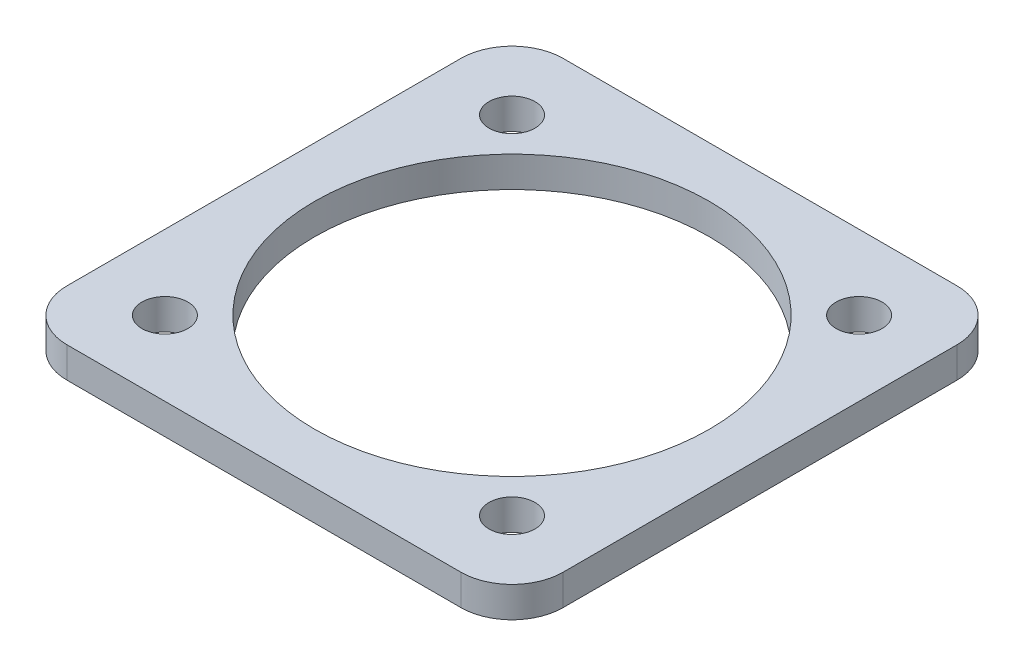
ISO-10303-21;
HEADER;
FILE_DESCRIPTION(('STEP AP214'),'2;1');
FILE_NAME('part.step','',(''),(''),'','','');
FILE_SCHEMA(('AUTOMOTIVE_DESIGN { 1 0 10303 214 1 1 1 1 }'));
ENDSEC;
DATA;
#1=APPLICATION_CONTEXT('core data for automotive mechanical design processes');
#2=APPLICATION_PROTOCOL_DEFINITION('international standard','automotive_design',2000,#1);
#3=PRODUCT_CONTEXT('',#1,'mechanical');
#4=PRODUCT('Part','Part','',(#3));
#5=PRODUCT_RELATED_PRODUCT_CATEGORY('part','',(#4));
#6=PRODUCT_DEFINITION_FORMATION('','',#4);
#7=PRODUCT_DEFINITION_CONTEXT('part definition',#1,'design');
#8=PRODUCT_DEFINITION('design','',#6,#7);
#9=PRODUCT_DEFINITION_SHAPE('','',#8);
#10=(LENGTH_UNIT() NAMED_UNIT(*) SI_UNIT(.MILLI.,.METRE.));
#11=(NAMED_UNIT(*) PLANE_ANGLE_UNIT() SI_UNIT($,.RADIAN.));
#12=(NAMED_UNIT(*) SI_UNIT($,.STERADIAN.) SOLID_ANGLE_UNIT());
#13=UNCERTAINTY_MEASURE_WITH_UNIT(LENGTH_MEASURE(1.E-05),#10,'distance_accuracy_value','');
#14=(GEOMETRIC_REPRESENTATION_CONTEXT(3) GLOBAL_UNCERTAINTY_ASSIGNED_CONTEXT((#13)) GLOBAL_UNIT_ASSIGNED_CONTEXT((#10,
#11,#12)) REPRESENTATION_CONTEXT('',''));
#15=CARTESIAN_POINT('',(0.,0.,0.));
#16=DIRECTION('',(0.,0.,1.));
#17=DIRECTION('',(1.,0.,0.));
#18=AXIS2_PLACEMENT_3D('',#15,#16,#17);
#19=CARTESIAN_POINT('',(-19.2537625946986,3.,19.2537625946986));
#20=DIRECTION('',(0.,-1.,0.));
#21=DIRECTION('',(0.,0.,-1.));
#22=AXIS2_PLACEMENT_3D('',#19,#20,#21);
#23=PLANE('',#22);
#24=CARTESIAN_POINT('',(-19.2537625946986,3.,19.2537625946986));
#25=DIRECTION('',(0.,1.,0.));
#26=DIRECTION('',(0.,0.,-1.));
#27=AXIS2_PLACEMENT_3D('',#24,#25,#26);
#28=CIRCLE('',#27,5.);
#29=CARTESIAN_POINT('',(-24.2537625946986,3.,19.2537625946986));
#30=VERTEX_POINT('',#29);
#31=CARTESIAN_POINT('',(-19.2537625946986,3.,24.2537625946986));
#32=VERTEX_POINT('',#31);
#33=EDGE_CURVE('E148',#30,#32,#28,.T.);
#34=ORIENTED_EDGE('',*,*,#33,.T.);
#35=DIRECTION('',(1.,0.,0.));
#36=VECTOR('',#35,1.);
#37=CARTESIAN_POINT('',(-19.2537625946986,3.,24.2537625946986));
#38=LINE('',#37,#36);
#39=CARTESIAN_POINT('',(19.2537625946986,3.,24.2537625946986));
#40=VERTEX_POINT('',#39);
#41=EDGE_CURVE('E96',#32,#40,#38,.T.);
#42=ORIENTED_EDGE('',*,*,#41,.T.);
#43=CARTESIAN_POINT('',(19.2537625946986,3.,19.2537625946986));
#44=DIRECTION('',(0.,1.,0.));
#45=DIRECTION('',(0.,0.,1.));
#46=AXIS2_PLACEMENT_3D('',#43,#44,#45);
#47=CIRCLE('',#46,5.);
#48=CARTESIAN_POINT('',(24.2537625946986,3.,19.2537625946986));
#49=VERTEX_POINT('',#48);
#50=EDGE_CURVE('E163',#40,#49,#47,.T.);
#51=ORIENTED_EDGE('',*,*,#50,.T.);
#52=DIRECTION('',(0.,0.,-1.));
#53=VECTOR('',#52,1.);
#54=CARTESIAN_POINT('',(24.2537625946986,3.,19.2537625946986));
#55=LINE('',#54,#53);
#56=CARTESIAN_POINT('',(24.2537625946986,3.,-19.2537625946986));
#57=VERTEX_POINT('',#56);
#58=EDGE_CURVE('E176',#49,#57,#55,.T.);
#59=ORIENTED_EDGE('',*,*,#58,.T.);
#60=CARTESIAN_POINT('',(19.2537625946986,3.,-19.2537625946986));
#61=DIRECTION('',(0.,1.,0.));
#62=DIRECTION('',(0.,0.,-1.));
#63=AXIS2_PLACEMENT_3D('',#60,#61,#62);
#64=CIRCLE('',#63,5.);
#65=CARTESIAN_POINT('',(19.2537625946986,3.,-24.2537625946986));
#66=VERTEX_POINT('',#65);
#67=EDGE_CURVE('E115',#57,#66,#64,.T.);
#68=ORIENTED_EDGE('',*,*,#67,.T.);
#69=DIRECTION('',(-1.,0.,0.));
#70=VECTOR('',#69,1.);
#71=CARTESIAN_POINT('',(-19.2537625946986,3.,-24.2537625946986));
#72=LINE('',#71,#70);
#73=CARTESIAN_POINT('',(-19.2537625946986,3.,-24.2537625946986));
#74=VERTEX_POINT('',#73);
#75=EDGE_CURVE('E109',#66,#74,#72,.T.);
#76=ORIENTED_EDGE('',*,*,#75,.T.);
#77=CARTESIAN_POINT('',(-19.2537625946986,3.,-19.2537625946986));
#78=DIRECTION('',(0.,1.,0.));
#79=DIRECTION('',(0.,0.,-1.));
#80=AXIS2_PLACEMENT_3D('',#77,#78,#79);
#81=CIRCLE('',#80,5.);
#82=CARTESIAN_POINT('',(-24.2537625946986,3.,-19.2537625946986));
#83=VERTEX_POINT('',#82);
#84=EDGE_CURVE('E113',#74,#83,#81,.T.);
#85=ORIENTED_EDGE('',*,*,#84,.T.);
#86=DIRECTION('',(0.,0.,1.));
#87=VECTOR('',#86,1.);
#88=CARTESIAN_POINT('',(-24.2537625946986,3.,19.2537625946986));
#89=LINE('',#88,#87);
#90=EDGE_CURVE('E53',#83,#30,#89,.T.);
#91=ORIENTED_EDGE('',*,*,#90,.T.);
#92=EDGE_LOOP('',(#34,#42,#51,#59,#68,#76,#85,#91));
#93=FACE_BOUND('',#92,.T.);
#94=CARTESIAN_POINT('',(0.,3.,0.));
#95=DIRECTION('',(0.,1.,0.));
#96=DIRECTION('',(0.,0.,1.));
#97=AXIS2_PLACEMENT_3D('',#94,#95,#96);
#98=CIRCLE('',#97,19.3);
#99=CARTESIAN_POINT('',(0.,3.,19.3));
#100=VERTEX_POINT('',#99);
#101=EDGE_CURVE('E137',#100,#100,#98,.T.);
#102=ORIENTED_EDGE('',*,*,#101,.F.);
#103=EDGE_LOOP('',(#102));
#104=FACE_BOUND('',#103,.T.);
#105=CARTESIAN_POINT('',(-16.9705627484771,3.,-16.9705627484771));
#106=DIRECTION('',(0.,1.,0.));
#107=DIRECTION('',(0.,0.,1.));
#108=AXIS2_PLACEMENT_3D('',#105,#106,#107);
#109=CIRCLE('',#108,2.25);
#110=CARTESIAN_POINT('',(-16.9705627484771,3.,-14.7205627484771));
#111=VERTEX_POINT('',#110);
#112=EDGE_CURVE('E185',#111,#111,#109,.T.);
#113=ORIENTED_EDGE('',*,*,#112,.F.);
#114=EDGE_LOOP('',(#113));
#115=FACE_BOUND('',#114,.T.);
#116=CARTESIAN_POINT('',(16.9705627484771,3.,-16.9705627484771));
#117=DIRECTION('',(0.,1.,0.));
#118=DIRECTION('',(0.,0.,1.));
#119=AXIS2_PLACEMENT_3D('',#116,#117,#118);
#120=CIRCLE('',#119,2.25);
#121=CARTESIAN_POINT('',(16.9705627484771,3.,-14.7205627484771));
#122=VERTEX_POINT('',#121);
#123=EDGE_CURVE('E191',#122,#122,#120,.T.);
#124=ORIENTED_EDGE('',*,*,#123,.F.);
#125=EDGE_LOOP('',(#124));
#126=FACE_BOUND('',#125,.T.);
#127=CARTESIAN_POINT('',(16.9705627484771,3.,16.9705627484771));
#128=DIRECTION('',(0.,1.,0.));
#129=DIRECTION('',(0.,0.,1.));
#130=AXIS2_PLACEMENT_3D('',#127,#128,#129);
#131=CIRCLE('',#130,2.25);
#132=CARTESIAN_POINT('',(16.9705627484771,3.,19.2205627484771));
#133=VERTEX_POINT('',#132);
#134=EDGE_CURVE('E197',#133,#133,#131,.T.);
#135=ORIENTED_EDGE('',*,*,#134,.F.);
#136=EDGE_LOOP('',(#135));
#137=FACE_BOUND('',#136,.T.);
#138=CARTESIAN_POINT('',(-16.9705627484771,3.,16.9705627484771));
#139=DIRECTION('',(0.,1.,0.));
#140=DIRECTION('',(0.,0.,1.));
#141=AXIS2_PLACEMENT_3D('',#138,#139,#140);
#142=CIRCLE('',#141,2.25);
#143=CARTESIAN_POINT('',(-16.9705627484771,3.,19.2205627484771));
#144=VERTEX_POINT('',#143);
#145=EDGE_CURVE('E203',#144,#144,#142,.T.);
#146=ORIENTED_EDGE('',*,*,#145,.F.);
#147=EDGE_LOOP('',(#146));
#148=FACE_BOUND('',#147,.T.);
#149=ADVANCED_FACE('F36',(#93,#104,#115,#126,#137,#148),#23,.F.);
#150=CARTESIAN_POINT('',(-19.2537625946986,0.,19.2537625946986));
#151=DIRECTION('',(0.,-1.,0.));
#152=DIRECTION('',(0.,0.,-1.));
#153=AXIS2_PLACEMENT_3D('',#150,#151,#152);
#154=PLANE('',#153);
#155=CARTESIAN_POINT('',(16.9705627484771,0.,16.9705627484771));
#156=DIRECTION('',(0.,1.,0.));
#157=DIRECTION('',(0.,0.,1.));
#158=AXIS2_PLACEMENT_3D('',#155,#156,#157);
#159=CIRCLE('',#158,2.25);
#160=CARTESIAN_POINT('',(16.9705627484771,0.,19.2205627484771));
#161=VERTEX_POINT('',#160);
#162=EDGE_CURVE('E200',#161,#161,#159,.T.);
#163=ORIENTED_EDGE('',*,*,#162,.T.);
#164=EDGE_LOOP('',(#163));
#165=FACE_BOUND('',#164,.T.);
#166=CARTESIAN_POINT('',(-16.9705627484771,0.,-16.9705627484771));
#167=DIRECTION('',(0.,1.,0.));
#168=DIRECTION('',(0.,0.,1.));
#169=AXIS2_PLACEMENT_3D('',#166,#167,#168);
#170=CIRCLE('',#169,2.25);
#171=CARTESIAN_POINT('',(-16.9705627484771,0.,-14.7205627484771));
#172=VERTEX_POINT('',#171);
#173=EDGE_CURVE('E188',#172,#172,#170,.T.);
#174=ORIENTED_EDGE('',*,*,#173,.T.);
#175=EDGE_LOOP('',(#174));
#176=FACE_BOUND('',#175,.T.);
#177=CARTESIAN_POINT('',(-19.2537625946986,0.,19.2537625946986));
#178=DIRECTION('',(0.,1.,0.));
#179=DIRECTION('',(0.,0.,-1.));
#180=AXIS2_PLACEMENT_3D('',#177,#178,#179);
#181=CIRCLE('',#180,5.);
#182=CARTESIAN_POINT('',(-24.2537625946986,0.,19.2537625946986));
#183=VERTEX_POINT('',#182);
#184=CARTESIAN_POINT('',(-19.2537625946986,0.,24.2537625946986));
#185=VERTEX_POINT('',#184);
#186=EDGE_CURVE('E133',#183,#185,#181,.T.);
#187=ORIENTED_EDGE('',*,*,#186,.F.);
#188=DIRECTION('',(0.,0.,1.));
#189=VECTOR('',#188,1.);
#190=CARTESIAN_POINT('',(-24.2537625946986,0.,19.2537625946986));
#191=LINE('',#190,#189);
#192=CARTESIAN_POINT('',(-24.2537625946986,0.,-19.2537625946986));
#193=VERTEX_POINT('',#192);
#194=EDGE_CURVE('E88',#193,#183,#191,.T.);
#195=ORIENTED_EDGE('',*,*,#194,.F.);
#196=CARTESIAN_POINT('',(-19.2537625946986,0.,-19.2537625946986));
#197=DIRECTION('',(0.,1.,0.));
#198=DIRECTION('',(0.,0.,-1.));
#199=AXIS2_PLACEMENT_3D('',#196,#197,#198);
#200=CIRCLE('',#199,5.);
#201=CARTESIAN_POINT('',(-19.2537625946986,0.,-24.2537625946986));
#202=VERTEX_POINT('',#201);
#203=EDGE_CURVE('E82',#202,#193,#200,.T.);
#204=ORIENTED_EDGE('',*,*,#203,.F.);
#205=DIRECTION('',(-1.,0.,0.));
#206=VECTOR('',#205,1.);
#207=CARTESIAN_POINT('',(-19.2537625946986,0.,-24.2537625946986));
#208=LINE('',#207,#206);
#209=CARTESIAN_POINT('',(19.2537625946986,0.,-24.2537625946986));
#210=VERTEX_POINT('',#209);
#211=EDGE_CURVE('E123',#210,#202,#208,.T.);
#212=ORIENTED_EDGE('',*,*,#211,.F.);
#213=CARTESIAN_POINT('',(19.2537625946986,0.,-19.2537625946986));
#214=DIRECTION('',(0.,1.,0.));
#215=DIRECTION('',(0.,0.,-1.));
#216=AXIS2_PLACEMENT_3D('',#213,#214,#215);
#217=CIRCLE('',#216,5.);
#218=CARTESIAN_POINT('',(24.2537625946986,0.,-19.2537625946986));
#219=VERTEX_POINT('',#218);
#220=EDGE_CURVE('E143',#219,#210,#217,.T.);
#221=ORIENTED_EDGE('',*,*,#220,.F.);
#222=DIRECTION('',(0.,0.,-1.));
#223=VECTOR('',#222,1.);
#224=CARTESIAN_POINT('',(24.2537625946986,0.,19.2537625946986));
#225=LINE('',#224,#223);
#226=CARTESIAN_POINT('',(24.2537625946986,0.,19.2537625946986));
#227=VERTEX_POINT('',#226);
#228=EDGE_CURVE('E141',#227,#219,#225,.T.);
#229=ORIENTED_EDGE('',*,*,#228,.F.);
#230=CARTESIAN_POINT('',(19.2537625946986,0.,19.2537625946986));
#231=DIRECTION('',(0.,1.,0.));
#232=DIRECTION('',(0.,0.,1.));
#233=AXIS2_PLACEMENT_3D('',#230,#231,#232);
#234=CIRCLE('',#233,5.);
#235=CARTESIAN_POINT('',(19.2537625946986,0.,24.2537625946986));
#236=VERTEX_POINT('',#235);
#237=EDGE_CURVE('E139',#236,#227,#234,.T.);
#238=ORIENTED_EDGE('',*,*,#237,.F.);
#239=DIRECTION('',(1.,0.,0.));
#240=VECTOR('',#239,1.);
#241=CARTESIAN_POINT('',(-19.2537625946986,0.,24.2537625946986));
#242=LINE('',#241,#240);
#243=EDGE_CURVE('E136',#185,#236,#242,.T.);
#244=ORIENTED_EDGE('',*,*,#243,.F.);
#245=EDGE_LOOP('',(#187,#195,#204,#212,#221,#229,#238,#244));
#246=FACE_BOUND('',#245,.T.);
#247=CARTESIAN_POINT('',(0.,0.,0.));
#248=DIRECTION('',(0.,1.,0.));
#249=DIRECTION('',(0.,0.,1.));
#250=AXIS2_PLACEMENT_3D('',#247,#248,#249);
#251=CIRCLE('',#250,19.3);
#252=CARTESIAN_POINT('',(0.,0.,19.3));
#253=VERTEX_POINT('',#252);
#254=EDGE_CURVE('E182',#253,#253,#251,.T.);
#255=ORIENTED_EDGE('',*,*,#254,.T.);
#256=EDGE_LOOP('',(#255));
#257=FACE_BOUND('',#256,.T.);
#258=CARTESIAN_POINT('',(16.9705627484771,0.,-16.9705627484771));
#259=DIRECTION('',(0.,1.,0.));
#260=DIRECTION('',(0.,0.,1.));
#261=AXIS2_PLACEMENT_3D('',#258,#259,#260);
#262=CIRCLE('',#261,2.25);
#263=CARTESIAN_POINT('',(16.9705627484771,0.,-14.7205627484771));
#264=VERTEX_POINT('',#263);
#265=EDGE_CURVE('E194',#264,#264,#262,.T.);
#266=ORIENTED_EDGE('',*,*,#265,.T.);
#267=EDGE_LOOP('',(#266));
#268=FACE_BOUND('',#267,.T.);
#269=CARTESIAN_POINT('',(-16.9705627484771,0.,16.9705627484771));
#270=DIRECTION('',(0.,1.,0.));
#271=DIRECTION('',(0.,0.,1.));
#272=AXIS2_PLACEMENT_3D('',#269,#270,#271);
#273=CIRCLE('',#272,2.25);
#274=CARTESIAN_POINT('',(-16.9705627484771,0.,19.2205627484771));
#275=VERTEX_POINT('',#274);
#276=EDGE_CURVE('E206',#275,#275,#273,.T.);
#277=ORIENTED_EDGE('',*,*,#276,.T.);
#278=EDGE_LOOP('',(#277));
#279=FACE_BOUND('',#278,.T.);
#280=ADVANCED_FACE('F167',(#165,#176,#246,#257,#268,#279),#154,.T.);
#281=CARTESIAN_POINT('',(-19.2537625946986,3.,19.2537625946986));
#282=DIRECTION('',(0.,-1.,0.));
#283=DIRECTION('',(0.,0.,-1.));
#284=AXIS2_PLACEMENT_3D('',#281,#282,#283);
#285=CYLINDRICAL_SURFACE('',#284,5.);
#286=ORIENTED_EDGE('',*,*,#186,.T.);
#287=DIRECTION('',(0.,-1.,0.));
#288=VECTOR('',#287,1.);
#289=CARTESIAN_POINT('',(-19.2537625946986,3.,24.2537625946986));
#290=LINE('',#289,#288);
#291=EDGE_CURVE('E11',#32,#185,#290,.T.);
#292=ORIENTED_EDGE('',*,*,#291,.F.);
#293=ORIENTED_EDGE('',*,*,#33,.F.);
#294=DIRECTION('',(0.,-1.,0.));
#295=VECTOR('',#294,1.);
#296=CARTESIAN_POINT('',(-24.2537625946986,3.,19.2537625946986));
#297=LINE('',#296,#295);
#298=EDGE_CURVE('E129',#30,#183,#297,.T.);
#299=ORIENTED_EDGE('',*,*,#298,.T.);
#300=EDGE_LOOP('',(#286,#292,#293,#299));
#301=FACE_BOUND('',#300,.T.);
#302=ADVANCED_FACE('F38',(#301),#285,.T.);
#303=CARTESIAN_POINT('',(-19.2537625946986,3.,24.2537625946986));
#304=DIRECTION('',(0.,0.,-1.));
#305=DIRECTION('',(-1.,0.,0.));
#306=AXIS2_PLACEMENT_3D('',#303,#304,#305);
#307=PLANE('',#306);
#308=ORIENTED_EDGE('',*,*,#243,.T.);
#309=DIRECTION('',(0.,-1.,0.));
#310=VECTOR('',#309,1.);
#311=CARTESIAN_POINT('',(19.2537625946986,3.,24.2537625946986));
#312=LINE('',#311,#310);
#313=EDGE_CURVE('E45',#40,#236,#312,.T.);
#314=ORIENTED_EDGE('',*,*,#313,.F.);
#315=ORIENTED_EDGE('',*,*,#41,.F.);
#316=ORIENTED_EDGE('',*,*,#291,.T.);
#317=EDGE_LOOP('',(#308,#314,#315,#316));
#318=FACE_BOUND('',#317,.T.);
#319=ADVANCED_FACE('F238',(#318),#307,.F.);
#320=CARTESIAN_POINT('',(19.2537625946986,3.,19.2537625946986));
#321=DIRECTION('',(0.,-1.,0.));
#322=DIRECTION('',(0.,0.,-1.));
#323=AXIS2_PLACEMENT_3D('',#320,#321,#322);
#324=CYLINDRICAL_SURFACE('',#323,5.);
#325=ORIENTED_EDGE('',*,*,#237,.T.);
#326=DIRECTION('',(0.,-1.,0.));
#327=VECTOR('',#326,1.);
#328=CARTESIAN_POINT('',(24.2537625946986,3.,19.2537625946986));
#329=LINE('',#328,#327);
#330=EDGE_CURVE('E155',#49,#227,#329,.T.);
#331=ORIENTED_EDGE('',*,*,#330,.F.);
#332=ORIENTED_EDGE('',*,*,#50,.F.);
#333=ORIENTED_EDGE('',*,*,#313,.T.);
#334=EDGE_LOOP('',(#325,#331,#332,#333));
#335=FACE_BOUND('',#334,.T.);
#336=ADVANCED_FACE('F161',(#335),#324,.T.);
#337=CARTESIAN_POINT('',(24.2537625946986,3.,19.2537625946986));
#338=DIRECTION('',(-1.,0.,0.));
#339=DIRECTION('',(0.,0.,1.));
#340=AXIS2_PLACEMENT_3D('',#337,#338,#339);
#341=PLANE('',#340);
#342=ORIENTED_EDGE('',*,*,#228,.T.);
#343=DIRECTION('',(0.,-1.,0.));
#344=VECTOR('',#343,1.);
#345=CARTESIAN_POINT('',(24.2537625946986,3.,-19.2537625946986));
#346=LINE('',#345,#344);
#347=EDGE_CURVE('E152',#57,#219,#346,.T.);
#348=ORIENTED_EDGE('',*,*,#347,.F.);
#349=ORIENTED_EDGE('',*,*,#58,.F.);
#350=ORIENTED_EDGE('',*,*,#330,.T.);
#351=EDGE_LOOP('',(#342,#348,#349,#350));
#352=FACE_BOUND('',#351,.T.);
#353=ADVANCED_FACE('F172',(#352),#341,.F.);
#354=CARTESIAN_POINT('',(19.2537625946986,3.,-19.2537625946986));
#355=DIRECTION('',(0.,-1.,0.));
#356=DIRECTION('',(0.,0.,-1.));
#357=AXIS2_PLACEMENT_3D('',#354,#355,#356);
#358=CYLINDRICAL_SURFACE('',#357,5.);
#359=ORIENTED_EDGE('',*,*,#220,.T.);
#360=DIRECTION('',(0.,-1.,0.));
#361=VECTOR('',#360,1.);
#362=CARTESIAN_POINT('',(19.2537625946986,3.,-24.2537625946986));
#363=LINE('',#362,#361);
#364=EDGE_CURVE('E124',#66,#210,#363,.T.);
#365=ORIENTED_EDGE('',*,*,#364,.F.);
#366=ORIENTED_EDGE('',*,*,#67,.F.);
#367=ORIENTED_EDGE('',*,*,#347,.T.);
#368=EDGE_LOOP('',(#359,#365,#366,#367));
#369=FACE_BOUND('',#368,.T.);
#370=ADVANCED_FACE('F175',(#369),#358,.T.);
#371=CARTESIAN_POINT('',(-19.2537625946986,3.,-24.2537625946986));
#372=DIRECTION('',(0.,0.,1.));
#373=DIRECTION('',(1.,0.,0.));
#374=AXIS2_PLACEMENT_3D('',#371,#372,#373);
#375=PLANE('',#374);
#376=ORIENTED_EDGE('',*,*,#211,.T.);
#377=DIRECTION('',(0.,-1.,0.));
#378=VECTOR('',#377,1.);
#379=CARTESIAN_POINT('',(-19.2537625946986,3.,-24.2537625946986));
#380=LINE('',#379,#378);
#381=EDGE_CURVE('E120',#74,#202,#380,.T.);
#382=ORIENTED_EDGE('',*,*,#381,.F.);
#383=ORIENTED_EDGE('',*,*,#75,.F.);
#384=ORIENTED_EDGE('',*,*,#364,.T.);
#385=EDGE_LOOP('',(#376,#382,#383,#384));
#386=FACE_BOUND('',#385,.T.);
#387=ADVANCED_FACE('F121',(#386),#375,.F.);
#388=CARTESIAN_POINT('',(-19.2537625946986,3.,-19.2537625946986));
#389=DIRECTION('',(0.,-1.,0.));
#390=DIRECTION('',(0.,0.,-1.));
#391=AXIS2_PLACEMENT_3D('',#388,#389,#390);
#392=CYLINDRICAL_SURFACE('',#391,5.);
#393=ORIENTED_EDGE('',*,*,#203,.T.);
#394=DIRECTION('',(0.,-1.,0.));
#395=VECTOR('',#394,1.);
#396=CARTESIAN_POINT('',(-24.2537625946986,3.,-19.2537625946986));
#397=LINE('',#396,#395);
#398=EDGE_CURVE('E125',#83,#193,#397,.T.);
#399=ORIENTED_EDGE('',*,*,#398,.F.);
#400=ORIENTED_EDGE('',*,*,#84,.F.);
#401=ORIENTED_EDGE('',*,*,#381,.T.);
#402=EDGE_LOOP('',(#393,#399,#400,#401));
#403=FACE_BOUND('',#402,.T.);
#404=ADVANCED_FACE('F127',(#403),#392,.T.);
#405=CARTESIAN_POINT('',(-24.2537625946986,3.,19.2537625946986));
#406=DIRECTION('',(1.,0.,0.));
#407=DIRECTION('',(0.,0.,-1.));
#408=AXIS2_PLACEMENT_3D('',#405,#406,#407);
#409=PLANE('',#408);
#410=ORIENTED_EDGE('',*,*,#194,.T.);
#411=ORIENTED_EDGE('',*,*,#298,.F.);
#412=ORIENTED_EDGE('',*,*,#90,.F.);
#413=ORIENTED_EDGE('',*,*,#398,.T.);
#414=EDGE_LOOP('',(#410,#411,#412,#413));
#415=FACE_BOUND('',#414,.T.);
#416=ADVANCED_FACE('F226',(#415),#409,.F.);
#417=CARTESIAN_POINT('',(0.,3.,0.));
#418=DIRECTION('',(0.,-1.,0.));
#419=DIRECTION('',(0.,0.,-1.));
#420=AXIS2_PLACEMENT_3D('',#417,#418,#419);
#421=CYLINDRICAL_SURFACE('',#420,19.3);
#422=ORIENTED_EDGE('',*,*,#101,.T.);
#423=EDGE_LOOP('',(#422));
#424=FACE_BOUND('',#423,.T.);
#425=ORIENTED_EDGE('',*,*,#254,.F.);
#426=EDGE_LOOP('',(#425));
#427=FACE_BOUND('',#426,.T.);
#428=ADVANCED_FACE('F223',(#424,#427),#421,.F.);
#429=CARTESIAN_POINT('',(-16.9705627484771,3.,-16.9705627484771));
#430=DIRECTION('',(0.,-1.,0.));
#431=DIRECTION('',(0.,0.,-1.));
#432=AXIS2_PLACEMENT_3D('',#429,#430,#431);
#433=CYLINDRICAL_SURFACE('',#432,2.25);
#434=ORIENTED_EDGE('',*,*,#112,.T.);
#435=EDGE_LOOP('',(#434));
#436=FACE_BOUND('',#435,.T.);
#437=ORIENTED_EDGE('',*,*,#173,.F.);
#438=EDGE_LOOP('',(#437));
#439=FACE_BOUND('',#438,.T.);
#440=ADVANCED_FACE('F302',(#436,#439),#433,.F.);
#441=CARTESIAN_POINT('',(16.9705627484771,3.,-16.9705627484771));
#442=DIRECTION('',(0.,-1.,0.));
#443=DIRECTION('',(0.,0.,-1.));
#444=AXIS2_PLACEMENT_3D('',#441,#442,#443);
#445=CYLINDRICAL_SURFACE('',#444,2.25);
#446=ORIENTED_EDGE('',*,*,#123,.T.);
#447=EDGE_LOOP('',(#446));
#448=FACE_BOUND('',#447,.T.);
#449=ORIENTED_EDGE('',*,*,#265,.F.);
#450=EDGE_LOOP('',(#449));
#451=FACE_BOUND('',#450,.T.);
#452=ADVANCED_FACE('F310',(#448,#451),#445,.F.);
#453=CARTESIAN_POINT('',(16.9705627484771,3.,16.9705627484771));
#454=DIRECTION('',(0.,-1.,0.));
#455=DIRECTION('',(0.,0.,-1.));
#456=AXIS2_PLACEMENT_3D('',#453,#454,#455);
#457=CYLINDRICAL_SURFACE('',#456,2.25);
#458=ORIENTED_EDGE('',*,*,#134,.T.);
#459=EDGE_LOOP('',(#458));
#460=FACE_BOUND('',#459,.T.);
#461=ORIENTED_EDGE('',*,*,#162,.F.);
#462=EDGE_LOOP('',(#461));
#463=FACE_BOUND('',#462,.T.);
#464=ADVANCED_FACE('F318',(#460,#463),#457,.F.);
#465=CARTESIAN_POINT('',(-16.9705627484771,3.,16.9705627484771));
#466=DIRECTION('',(0.,-1.,0.));
#467=DIRECTION('',(0.,0.,-1.));
#468=AXIS2_PLACEMENT_3D('',#465,#466,#467);
#469=CYLINDRICAL_SURFACE('',#468,2.25);
#470=ORIENTED_EDGE('',*,*,#145,.T.);
#471=EDGE_LOOP('',(#470));
#472=FACE_BOUND('',#471,.T.);
#473=ORIENTED_EDGE('',*,*,#276,.F.);
#474=EDGE_LOOP('',(#473));
#475=FACE_BOUND('',#474,.T.);
#476=ADVANCED_FACE('F212',(#472,#475),#469,.F.);
#477=CLOSED_SHELL('',(#149,#280,#302,#319,#336,#353,#370,#387,#404,#416,#428,#440,#452,#464,#476));
#478=MANIFOLD_SOLID_BREP('B2',#477);
#479=ADVANCED_BREP_SHAPE_REPRESENTATION('',(#18,#478),#14);
#480=SHAPE_DEFINITION_REPRESENTATION(#9,#479);
ENDSEC;
END-ISO-10303-21;
